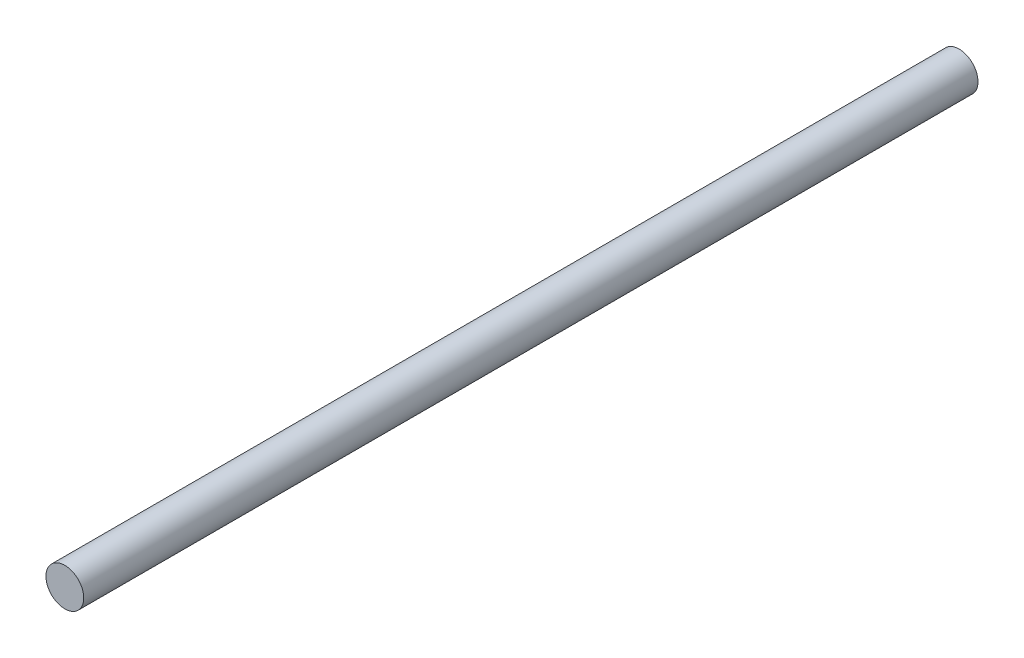
ISO-10303-21;
HEADER;
FILE_DESCRIPTION(('STEP AP214'),'2;1');
FILE_NAME('part.step','',(''),(''),'','','');
FILE_SCHEMA(('AUTOMOTIVE_DESIGN { 1 0 10303 214 1 1 1 1 }'));
ENDSEC;
DATA;
#1=APPLICATION_CONTEXT('core data for automotive mechanical design processes');
#2=APPLICATION_PROTOCOL_DEFINITION('international standard','automotive_design',2000,#1);
#3=PRODUCT_CONTEXT('',#1,'mechanical');
#4=PRODUCT('Part','Part','',(#3));
#5=PRODUCT_RELATED_PRODUCT_CATEGORY('part','',(#4));
#6=PRODUCT_DEFINITION_FORMATION('','',#4);
#7=PRODUCT_DEFINITION_CONTEXT('part definition',#1,'design');
#8=PRODUCT_DEFINITION('design','',#6,#7);
#9=PRODUCT_DEFINITION_SHAPE('','',#8);
#10=(LENGTH_UNIT() NAMED_UNIT(*) SI_UNIT(.MILLI.,.METRE.));
#11=(NAMED_UNIT(*) PLANE_ANGLE_UNIT() SI_UNIT($,.RADIAN.));
#12=(NAMED_UNIT(*) SI_UNIT($,.STERADIAN.) SOLID_ANGLE_UNIT());
#13=UNCERTAINTY_MEASURE_WITH_UNIT(LENGTH_MEASURE(1.E-05),#10,'distance_accuracy_value','');
#14=(GEOMETRIC_REPRESENTATION_CONTEXT(3) GLOBAL_UNCERTAINTY_ASSIGNED_CONTEXT((#13)) GLOBAL_UNIT_ASSIGNED_CONTEXT((#10,
#11,#12)) REPRESENTATION_CONTEXT('',''));
#15=CARTESIAN_POINT('',(0.,0.,0.));
#16=DIRECTION('',(0.,0.,1.));
#17=DIRECTION('',(1.,0.,0.));
#18=AXIS2_PLACEMENT_3D('',#15,#16,#17);
#19=CARTESIAN_POINT('',(0.,0.,142.));
#20=DIRECTION('',(0.,0.,-1.));
#21=DIRECTION('',(-1.,0.,0.));
#22=AXIS2_PLACEMENT_3D('',#19,#20,#21);
#23=CYLINDRICAL_SURFACE('',#22,3.);
#24=CARTESIAN_POINT('',(0.,0.,142.));
#25=DIRECTION('',(0.,0.,1.));
#26=DIRECTION('',(1.,0.,0.));
#27=AXIS2_PLACEMENT_3D('',#24,#25,#26);
#28=CIRCLE('',#27,3.);
#29=CARTESIAN_POINT('',(3.,0.,142.));
#30=VERTEX_POINT('',#29);
#31=EDGE_CURVE('E10',#30,#30,#28,.T.);
#32=ORIENTED_EDGE('',*,*,#31,.F.);
#33=EDGE_LOOP('',(#32));
#34=FACE_BOUND('',#33,.T.);
#35=CARTESIAN_POINT('',(0.,0.,0.));
#36=DIRECTION('',(0.,0.,1.));
#37=DIRECTION('',(1.,0.,0.));
#38=AXIS2_PLACEMENT_3D('',#35,#36,#37);
#39=CIRCLE('',#38,3.);
#40=CARTESIAN_POINT('',(3.,0.,0.));
#41=VERTEX_POINT('',#40);
#42=EDGE_CURVE('E36',#41,#41,#39,.T.);
#43=ORIENTED_EDGE('',*,*,#42,.T.);
#44=EDGE_LOOP('',(#43));
#45=FACE_BOUND('',#44,.T.);
#46=ADVANCED_FACE('F33',(#34,#45),#23,.T.);
#47=CARTESIAN_POINT('',(0.,0.,142.));
#48=DIRECTION('',(0.,0.,1.));
#49=DIRECTION('',(1.,0.,0.));
#50=AXIS2_PLACEMENT_3D('',#47,#48,#49);
#51=PLANE('',#50);
#52=ORIENTED_EDGE('',*,*,#31,.T.);
#53=EDGE_LOOP('',(#52));
#54=FACE_BOUND('',#53,.T.);
#55=ADVANCED_FACE('F48',(#54),#51,.T.);
#56=CARTESIAN_POINT('',(0.,0.,0.));
#57=DIRECTION('',(0.,0.,1.));
#58=DIRECTION('',(1.,0.,0.));
#59=AXIS2_PLACEMENT_3D('',#56,#57,#58);
#60=PLANE('',#59);
#61=ORIENTED_EDGE('',*,*,#42,.F.);
#62=EDGE_LOOP('',(#61));
#63=FACE_BOUND('',#62,.T.);
#64=ADVANCED_FACE('F46',(#63),#60,.F.);
#65=CLOSED_SHELL('',(#46,#55,#64));
#66=MANIFOLD_SOLID_BREP('B2',#65);
#67=ADVANCED_BREP_SHAPE_REPRESENTATION('',(#18,#66),#14);
#68=SHAPE_DEFINITION_REPRESENTATION(#9,#67);
ENDSEC;
END-ISO-10303-21;
